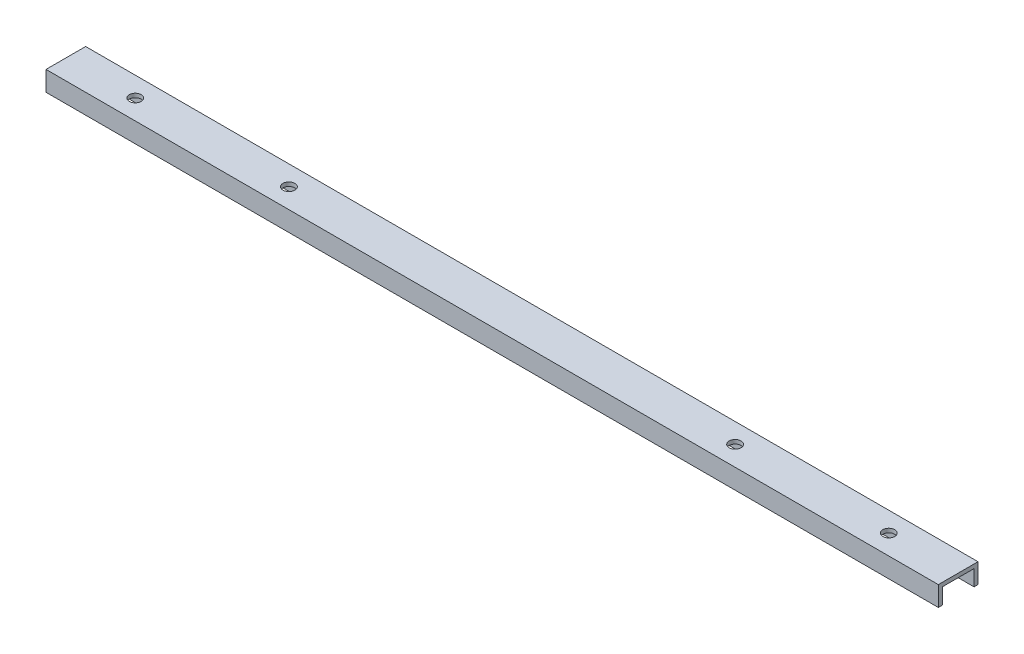
ISO-10303-21;
HEADER;
FILE_DESCRIPTION(('STEP AP214'),'2;1');
FILE_NAME('part.step','',(''),(''),'','','');
FILE_SCHEMA(('AUTOMOTIVE_DESIGN { 1 0 10303 214 1 1 1 1 }'));
ENDSEC;
DATA;
#1=APPLICATION_CONTEXT('core data for automotive mechanical design processes');
#2=APPLICATION_PROTOCOL_DEFINITION('international standard','automotive_design',2000,#1);
#3=PRODUCT_CONTEXT('',#1,'mechanical');
#4=PRODUCT('Part','Part','',(#3));
#5=PRODUCT_RELATED_PRODUCT_CATEGORY('part','',(#4));
#6=PRODUCT_DEFINITION_FORMATION('','',#4);
#7=PRODUCT_DEFINITION_CONTEXT('part definition',#1,'design');
#8=PRODUCT_DEFINITION('design','',#6,#7);
#9=PRODUCT_DEFINITION_SHAPE('','',#8);
#10=(LENGTH_UNIT() NAMED_UNIT(*) SI_UNIT(.MILLI.,.METRE.));
#11=(NAMED_UNIT(*) PLANE_ANGLE_UNIT() SI_UNIT($,.RADIAN.));
#12=(NAMED_UNIT(*) SI_UNIT($,.STERADIAN.) SOLID_ANGLE_UNIT());
#13=UNCERTAINTY_MEASURE_WITH_UNIT(LENGTH_MEASURE(1.E-05),#10,'distance_accuracy_value','');
#14=(GEOMETRIC_REPRESENTATION_CONTEXT(3) GLOBAL_UNCERTAINTY_ASSIGNED_CONTEXT((#13)) GLOBAL_UNIT_ASSIGNED_CONTEXT((#10,
#11,#12)) REPRESENTATION_CONTEXT('',''));
#15=CARTESIAN_POINT('',(0.,0.,0.));
#16=DIRECTION('',(0.,0.,1.));
#17=DIRECTION('',(1.,0.,0.));
#18=AXIS2_PLACEMENT_3D('',#15,#16,#17);
#19=CARTESIAN_POINT('',(450.,0.,18.));
#20=DIRECTION('',(0.,1.,0.));
#21=DIRECTION('',(0.,0.,1.));
#22=AXIS2_PLACEMENT_3D('',#19,#20,#21);
#23=PLANE('',#22);
#24=DIRECTION('',(0.,0.,-1.));
#25=VECTOR('',#24,1.);
#26=CARTESIAN_POINT('',(0.,0.,18.));
#27=LINE('',#26,#25);
#28=CARTESIAN_POINT('',(0.,0.,20.));
#29=VERTEX_POINT('',#28);
#30=CARTESIAN_POINT('',(0.,0.,18.));
#31=VERTEX_POINT('',#30);
#32=EDGE_CURVE('E139',#29,#31,#27,.T.);
#33=ORIENTED_EDGE('',*,*,#32,.T.);
#34=DIRECTION('',(-1.,0.,0.));
#35=VECTOR('',#34,1.);
#36=CARTESIAN_POINT('',(450.,0.,18.));
#37=LINE('',#36,#35);
#38=CARTESIAN_POINT('',(450.,0.,18.));
#39=VERTEX_POINT('',#38);
#40=EDGE_CURVE('E11',#39,#31,#37,.T.);
#41=ORIENTED_EDGE('',*,*,#40,.F.);
#42=DIRECTION('',(0.,0.,-1.));
#43=VECTOR('',#42,1.);
#44=CARTESIAN_POINT('',(450.,0.,18.));
#45=LINE('',#44,#43);
#46=CARTESIAN_POINT('',(450.,0.,20.));
#47=VERTEX_POINT('',#46);
#48=EDGE_CURVE('E162',#47,#39,#45,.T.);
#49=ORIENTED_EDGE('',*,*,#48,.F.);
#50=DIRECTION('',(-1.,0.,0.));
#51=VECTOR('',#50,1.);
#52=CARTESIAN_POINT('',(450.,0.,20.));
#53=LINE('',#52,#51);
#54=EDGE_CURVE('E135',#47,#29,#53,.T.);
#55=ORIENTED_EDGE('',*,*,#54,.T.);
#56=EDGE_LOOP('',(#33,#41,#49,#55));
#57=FACE_BOUND('',#56,.T.);
#58=ADVANCED_FACE('F38',(#57),#23,.F.);
#59=CARTESIAN_POINT('',(450.,8.,18.));
#60=DIRECTION('',(0.,0.,1.));
#61=DIRECTION('',(1.,0.,0.));
#62=AXIS2_PLACEMENT_3D('',#59,#60,#61);
#63=PLANE('',#62);
#64=DIRECTION('',(0.,1.,0.));
#65=VECTOR('',#64,1.);
#66=CARTESIAN_POINT('',(0.,8.,18.));
#67=LINE('',#66,#65);
#68=CARTESIAN_POINT('',(0.,8.,18.));
#69=VERTEX_POINT('',#68);
#70=EDGE_CURVE('E143',#31,#69,#67,.T.);
#71=ORIENTED_EDGE('',*,*,#70,.T.);
#72=DIRECTION('',(-1.,0.,0.));
#73=VECTOR('',#72,1.);
#74=CARTESIAN_POINT('',(450.,8.,18.));
#75=LINE('',#74,#73);
#76=CARTESIAN_POINT('',(450.,8.,18.));
#77=VERTEX_POINT('',#76);
#78=EDGE_CURVE('E47',#77,#69,#75,.T.);
#79=ORIENTED_EDGE('',*,*,#78,.F.);
#80=DIRECTION('',(0.,1.,0.));
#81=VECTOR('',#80,1.);
#82=CARTESIAN_POINT('',(450.,8.,18.));
#83=LINE('',#82,#81);
#84=EDGE_CURVE('E98',#39,#77,#83,.T.);
#85=ORIENTED_EDGE('',*,*,#84,.F.);
#86=ORIENTED_EDGE('',*,*,#40,.T.);
#87=EDGE_LOOP('',(#71,#79,#85,#86));
#88=FACE_BOUND('',#87,.T.);
#89=ADVANCED_FACE('F265',(#88),#63,.F.);
#90=CARTESIAN_POINT('',(450.,8.,2.));
#91=DIRECTION('',(0.,1.,0.));
#92=DIRECTION('',(0.,0.,1.));
#93=AXIS2_PLACEMENT_3D('',#90,#91,#92);
#94=PLANE('',#93);
#95=CARTESIAN_POINT('',(415.,8.,10.));
#96=DIRECTION('',(0.,1.,0.));
#97=DIRECTION('',(0.,0.,1.));
#98=AXIS2_PLACEMENT_3D('',#95,#96,#97);
#99=CIRCLE('',#98,2.99999999999999);
#100=CARTESIAN_POINT('',(415.,8.,13.));
#101=VERTEX_POINT('',#100);
#102=EDGE_CURVE('E144',#101,#101,#99,.F.);
#103=ORIENTED_EDGE('',*,*,#102,.F.);
#104=EDGE_LOOP('',(#103));
#105=FACE_BOUND('',#104,.T.);
#106=CARTESIAN_POINT('',(112.5,8.,10.));
#107=DIRECTION('',(0.,1.,0.));
#108=DIRECTION('',(0.,0.,1.));
#109=AXIS2_PLACEMENT_3D('',#106,#107,#108);
#110=CIRCLE('',#109,3.00000000000001);
#111=CARTESIAN_POINT('',(112.5,8.,13.));
#112=VERTEX_POINT('',#111);
#113=EDGE_CURVE('E215',#112,#112,#110,.F.);
#114=ORIENTED_EDGE('',*,*,#113,.F.);
#115=EDGE_LOOP('',(#114));
#116=FACE_BOUND('',#115,.T.);
#117=CARTESIAN_POINT('',(35.,8.,10.));
#118=DIRECTION('',(0.,1.,0.));
#119=DIRECTION('',(0.,0.,1.));
#120=AXIS2_PLACEMENT_3D('',#117,#118,#119);
#121=CIRCLE('',#120,3.);
#122=CARTESIAN_POINT('',(35.,8.,13.));
#123=VERTEX_POINT('',#122);
#124=EDGE_CURVE('E206',#123,#123,#121,.F.);
#125=ORIENTED_EDGE('',*,*,#124,.F.);
#126=EDGE_LOOP('',(#125));
#127=FACE_BOUND('',#126,.T.);
#128=CARTESIAN_POINT('',(337.5,8.,10.));
#129=DIRECTION('',(0.,1.,0.));
#130=DIRECTION('',(0.,0.,1.));
#131=AXIS2_PLACEMENT_3D('',#128,#129,#130);
#132=CIRCLE('',#131,2.99999999999999);
#133=CARTESIAN_POINT('',(337.5,8.,13.));
#134=VERTEX_POINT('',#133);
#135=EDGE_CURVE('E216',#134,#134,#132,.F.);
#136=ORIENTED_EDGE('',*,*,#135,.F.);
#137=EDGE_LOOP('',(#136));
#138=FACE_BOUND('',#137,.T.);
#139=DIRECTION('',(0.,0.,-1.));
#140=VECTOR('',#139,1.);
#141=CARTESIAN_POINT('',(0.,8.,2.));
#142=LINE('',#141,#140);
#143=CARTESIAN_POINT('',(0.,8.,2.));
#144=VERTEX_POINT('',#143);
#145=EDGE_CURVE('E147',#69,#144,#142,.T.);
#146=ORIENTED_EDGE('',*,*,#145,.T.);
#147=DIRECTION('',(-1.,0.,0.));
#148=VECTOR('',#147,1.);
#149=CARTESIAN_POINT('',(450.,8.,2.));
#150=LINE('',#149,#148);
#151=CARTESIAN_POINT('',(450.,8.,2.));
#152=VERTEX_POINT('',#151);
#153=EDGE_CURVE('E173',#152,#144,#150,.T.);
#154=ORIENTED_EDGE('',*,*,#153,.F.);
#155=DIRECTION('',(0.,0.,-1.));
#156=VECTOR('',#155,1.);
#157=CARTESIAN_POINT('',(450.,8.,2.));
#158=LINE('',#157,#156);
#159=EDGE_CURVE('E183',#77,#152,#158,.T.);
#160=ORIENTED_EDGE('',*,*,#159,.F.);
#161=ORIENTED_EDGE('',*,*,#78,.T.);
#162=EDGE_LOOP('',(#146,#154,#160,#161));
#163=FACE_BOUND('',#162,.T.);
#164=ADVANCED_FACE('F181',(#105,#116,#127,#138,#163),#94,.F.);
#165=CARTESIAN_POINT('',(450.,0.,2.));
#166=DIRECTION('',(0.,0.,-1.));
#167=DIRECTION('',(-1.,0.,0.));
#168=AXIS2_PLACEMENT_3D('',#165,#166,#167);
#169=PLANE('',#168);
#170=DIRECTION('',(0.,-1.,0.));
#171=VECTOR('',#170,1.);
#172=CARTESIAN_POINT('',(0.,0.,2.));
#173=LINE('',#172,#171);
#174=CARTESIAN_POINT('',(0.,0.,2.));
#175=VERTEX_POINT('',#174);
#176=EDGE_CURVE('E150',#144,#175,#173,.T.);
#177=ORIENTED_EDGE('',*,*,#176,.T.);
#178=DIRECTION('',(-1.,0.,0.));
#179=VECTOR('',#178,1.);
#180=CARTESIAN_POINT('',(450.,0.,2.));
#181=LINE('',#180,#179);
#182=CARTESIAN_POINT('',(450.,0.,2.));
#183=VERTEX_POINT('',#182);
#184=EDGE_CURVE('E169',#183,#175,#181,.T.);
#185=ORIENTED_EDGE('',*,*,#184,.F.);
#186=DIRECTION('',(0.,-1.,0.));
#187=VECTOR('',#186,1.);
#188=CARTESIAN_POINT('',(450.,0.,2.));
#189=LINE('',#188,#187);
#190=EDGE_CURVE('E196',#152,#183,#189,.T.);
#191=ORIENTED_EDGE('',*,*,#190,.F.);
#192=ORIENTED_EDGE('',*,*,#153,.T.);
#193=EDGE_LOOP('',(#177,#185,#191,#192));
#194=FACE_BOUND('',#193,.T.);
#195=ADVANCED_FACE('F191',(#194),#169,.F.);
#196=CARTESIAN_POINT('',(450.,0.,0.));
#197=DIRECTION('',(0.,1.,0.));
#198=DIRECTION('',(0.,0.,1.));
#199=AXIS2_PLACEMENT_3D('',#196,#197,#198);
#200=PLANE('',#199);
#201=DIRECTION('',(0.,0.,-1.));
#202=VECTOR('',#201,1.);
#203=CARTESIAN_POINT('',(0.,0.,0.));
#204=LINE('',#203,#202);
#205=CARTESIAN_POINT('',(0.,0.,0.));
#206=VERTEX_POINT('',#205);
#207=EDGE_CURVE('E153',#175,#206,#204,.T.);
#208=ORIENTED_EDGE('',*,*,#207,.T.);
#209=DIRECTION('',(-1.,0.,0.));
#210=VECTOR('',#209,1.);
#211=CARTESIAN_POINT('',(450.,0.,0.));
#212=LINE('',#211,#210);
#213=CARTESIAN_POINT('',(450.,0.,0.));
#214=VERTEX_POINT('',#213);
#215=EDGE_CURVE('E128',#214,#206,#212,.T.);
#216=ORIENTED_EDGE('',*,*,#215,.F.);
#217=DIRECTION('',(0.,0.,-1.));
#218=VECTOR('',#217,1.);
#219=CARTESIAN_POINT('',(450.,0.,0.));
#220=LINE('',#219,#218);
#221=EDGE_CURVE('E117',#183,#214,#220,.T.);
#222=ORIENTED_EDGE('',*,*,#221,.F.);
#223=ORIENTED_EDGE('',*,*,#184,.T.);
#224=EDGE_LOOP('',(#208,#216,#222,#223));
#225=FACE_BOUND('',#224,.T.);
#226=ADVANCED_FACE('F194',(#225),#200,.F.);
#227=CARTESIAN_POINT('',(450.,10.,0.));
#228=DIRECTION('',(0.,0.,1.));
#229=DIRECTION('',(1.,0.,0.));
#230=AXIS2_PLACEMENT_3D('',#227,#228,#229);
#231=PLANE('',#230);
#232=DIRECTION('',(0.,1.,0.));
#233=VECTOR('',#232,1.);
#234=CARTESIAN_POINT('',(0.,10.,0.));
#235=LINE('',#234,#233);
#236=CARTESIAN_POINT('',(0.,10.,0.));
#237=VERTEX_POINT('',#236);
#238=EDGE_CURVE('E126',#206,#237,#235,.T.);
#239=ORIENTED_EDGE('',*,*,#238,.T.);
#240=DIRECTION('',(-1.,0.,0.));
#241=VECTOR('',#240,1.);
#242=CARTESIAN_POINT('',(450.,10.,0.));
#243=LINE('',#242,#241);
#244=CARTESIAN_POINT('',(450.,10.,0.));
#245=VERTEX_POINT('',#244);
#246=EDGE_CURVE('E123',#245,#237,#243,.T.);
#247=ORIENTED_EDGE('',*,*,#246,.F.);
#248=DIRECTION('',(0.,1.,0.));
#249=VECTOR('',#248,1.);
#250=CARTESIAN_POINT('',(450.,10.,0.));
#251=LINE('',#250,#249);
#252=EDGE_CURVE('E111',#214,#245,#251,.T.);
#253=ORIENTED_EDGE('',*,*,#252,.F.);
#254=ORIENTED_EDGE('',*,*,#215,.T.);
#255=EDGE_LOOP('',(#239,#247,#253,#254));
#256=FACE_BOUND('',#255,.T.);
#257=ADVANCED_FACE('F124',(#256),#231,.F.);
#258=CARTESIAN_POINT('',(450.,10.,20.));
#259=DIRECTION('',(0.,-1.,0.));
#260=DIRECTION('',(0.,0.,-1.));
#261=AXIS2_PLACEMENT_3D('',#258,#259,#260);
#262=PLANE('',#261);
#263=CARTESIAN_POINT('',(415.,10.,10.));
#264=DIRECTION('',(0.,1.,0.));
#265=DIRECTION('',(0.,0.,1.));
#266=AXIS2_PLACEMENT_3D('',#263,#264,#265);
#267=CIRCLE('',#266,2.99999999999999);
#268=CARTESIAN_POINT('',(415.,10.,13.));
#269=VERTEX_POINT('',#268);
#270=EDGE_CURVE('E220',#269,#269,#267,.T.);
#271=ORIENTED_EDGE('',*,*,#270,.F.);
#272=EDGE_LOOP('',(#271));
#273=FACE_BOUND('',#272,.T.);
#274=CARTESIAN_POINT('',(112.5,10.,10.));
#275=DIRECTION('',(0.,1.,0.));
#276=DIRECTION('',(0.,0.,1.));
#277=AXIS2_PLACEMENT_3D('',#274,#275,#276);
#278=CIRCLE('',#277,3.00000000000001);
#279=CARTESIAN_POINT('',(112.5,10.,13.));
#280=VERTEX_POINT('',#279);
#281=EDGE_CURVE('E227',#280,#280,#278,.T.);
#282=ORIENTED_EDGE('',*,*,#281,.F.);
#283=EDGE_LOOP('',(#282));
#284=FACE_BOUND('',#283,.T.);
#285=CARTESIAN_POINT('',(35.,10.,10.));
#286=DIRECTION('',(0.,1.,0.));
#287=DIRECTION('',(0.,0.,1.));
#288=AXIS2_PLACEMENT_3D('',#285,#286,#287);
#289=CIRCLE('',#288,3.);
#290=CARTESIAN_POINT('',(35.,10.,13.));
#291=VERTEX_POINT('',#290);
#292=EDGE_CURVE('E211',#291,#291,#289,.T.);
#293=ORIENTED_EDGE('',*,*,#292,.F.);
#294=EDGE_LOOP('',(#293));
#295=FACE_BOUND('',#294,.T.);
#296=CARTESIAN_POINT('',(337.5,10.,10.));
#297=DIRECTION('',(0.,1.,0.));
#298=DIRECTION('',(0.,0.,1.));
#299=AXIS2_PLACEMENT_3D('',#296,#297,#298);
#300=CIRCLE('',#299,2.99999999999999);
#301=CARTESIAN_POINT('',(337.5,10.,13.));
#302=VERTEX_POINT('',#301);
#303=EDGE_CURVE('E210',#302,#302,#300,.T.);
#304=ORIENTED_EDGE('',*,*,#303,.F.);
#305=EDGE_LOOP('',(#304));
#306=FACE_BOUND('',#305,.T.);
#307=DIRECTION('',(0.,0.,1.));
#308=VECTOR('',#307,1.);
#309=CARTESIAN_POINT('',(0.,10.,20.));
#310=LINE('',#309,#308);
#311=CARTESIAN_POINT('',(0.,10.,20.));
#312=VERTEX_POINT('',#311);
#313=EDGE_CURVE('E84',#237,#312,#310,.T.);
#314=ORIENTED_EDGE('',*,*,#313,.T.);
#315=DIRECTION('',(-1.,0.,0.));
#316=VECTOR('',#315,1.);
#317=CARTESIAN_POINT('',(450.,10.,20.));
#318=LINE('',#317,#316);
#319=CARTESIAN_POINT('',(450.,10.,20.));
#320=VERTEX_POINT('',#319);
#321=EDGE_CURVE('E129',#320,#312,#318,.T.);
#322=ORIENTED_EDGE('',*,*,#321,.F.);
#323=DIRECTION('',(0.,0.,1.));
#324=VECTOR('',#323,1.);
#325=CARTESIAN_POINT('',(450.,10.,20.));
#326=LINE('',#325,#324);
#327=EDGE_CURVE('E115',#245,#320,#326,.T.);
#328=ORIENTED_EDGE('',*,*,#327,.F.);
#329=ORIENTED_EDGE('',*,*,#246,.T.);
#330=EDGE_LOOP('',(#314,#322,#328,#329));
#331=FACE_BOUND('',#330,.T.);
#332=ADVANCED_FACE('F131',(#273,#284,#295,#306,#331),#262,.F.);
#333=CARTESIAN_POINT('',(450.,0.,20.));
#334=DIRECTION('',(0.,0.,-1.));
#335=DIRECTION('',(-1.,0.,0.));
#336=AXIS2_PLACEMENT_3D('',#333,#334,#335);
#337=PLANE('',#336);
#338=DIRECTION('',(0.,-1.,0.));
#339=VECTOR('',#338,1.);
#340=CARTESIAN_POINT('',(0.,0.,20.));
#341=LINE('',#340,#339);
#342=EDGE_CURVE('E90',#312,#29,#341,.T.);
#343=ORIENTED_EDGE('',*,*,#342,.T.);
#344=ORIENTED_EDGE('',*,*,#54,.F.);
#345=DIRECTION('',(0.,-1.,0.));
#346=VECTOR('',#345,1.);
#347=CARTESIAN_POINT('',(450.,0.,20.));
#348=LINE('',#347,#346);
#349=EDGE_CURVE('E55',#320,#47,#348,.T.);
#350=ORIENTED_EDGE('',*,*,#349,.F.);
#351=ORIENTED_EDGE('',*,*,#321,.T.);
#352=EDGE_LOOP('',(#343,#344,#350,#351));
#353=FACE_BOUND('',#352,.T.);
#354=ADVANCED_FACE('F242',(#353),#337,.F.);
#355=CARTESIAN_POINT('',(450.,0.,0.));
#356=DIRECTION('',(-1.,0.,0.));
#357=DIRECTION('',(0.,0.,1.));
#358=AXIS2_PLACEMENT_3D('',#355,#356,#357);
#359=PLANE('',#358);
#360=ORIENTED_EDGE('',*,*,#48,.T.);
#361=ORIENTED_EDGE('',*,*,#84,.T.);
#362=ORIENTED_EDGE('',*,*,#159,.T.);
#363=ORIENTED_EDGE('',*,*,#190,.T.);
#364=ORIENTED_EDGE('',*,*,#221,.T.);
#365=ORIENTED_EDGE('',*,*,#252,.T.);
#366=ORIENTED_EDGE('',*,*,#327,.T.);
#367=ORIENTED_EDGE('',*,*,#349,.T.);
#368=EDGE_LOOP('',(#360,#361,#362,#363,#364,#365,#366,#367));
#369=FACE_BOUND('',#368,.T.);
#370=ADVANCED_FACE('F113',(#369),#359,.F.);
#371=CARTESIAN_POINT('',(0.,0.,0.));
#372=DIRECTION('',(-1.,0.,0.));
#373=DIRECTION('',(0.,0.,1.));
#374=AXIS2_PLACEMENT_3D('',#371,#372,#373);
#375=PLANE('',#374);
#376=ORIENTED_EDGE('',*,*,#32,.F.);
#377=ORIENTED_EDGE('',*,*,#342,.F.);
#378=ORIENTED_EDGE('',*,*,#313,.F.);
#379=ORIENTED_EDGE('',*,*,#238,.F.);
#380=ORIENTED_EDGE('',*,*,#207,.F.);
#381=ORIENTED_EDGE('',*,*,#176,.F.);
#382=ORIENTED_EDGE('',*,*,#145,.F.);
#383=ORIENTED_EDGE('',*,*,#70,.F.);
#384=EDGE_LOOP('',(#376,#377,#378,#379,#380,#381,#382,#383));
#385=FACE_BOUND('',#384,.T.);
#386=ADVANCED_FACE('F187',(#385),#375,.T.);
#387=CARTESIAN_POINT('',(337.5,-0.485281374238589,10.));
#388=DIRECTION('',(0.,1.,0.));
#389=DIRECTION('',(0.,0.,1.));
#390=AXIS2_PLACEMENT_3D('',#387,#388,#389);
#391=CYLINDRICAL_SURFACE('',#390,2.99999999999999);
#392=ORIENTED_EDGE('',*,*,#135,.T.);
#393=EDGE_LOOP('',(#392));
#394=FACE_BOUND('',#393,.T.);
#395=ORIENTED_EDGE('',*,*,#303,.T.);
#396=EDGE_LOOP('',(#395));
#397=FACE_BOUND('',#396,.T.);
#398=ADVANCED_FACE('F250',(#394,#397),#391,.F.);
#399=CARTESIAN_POINT('',(35.,-0.485281374238589,10.));
#400=DIRECTION('',(0.,1.,0.));
#401=DIRECTION('',(0.,0.,1.));
#402=AXIS2_PLACEMENT_3D('',#399,#400,#401);
#403=CYLINDRICAL_SURFACE('',#402,3.);
#404=ORIENTED_EDGE('',*,*,#124,.T.);
#405=EDGE_LOOP('',(#404));
#406=FACE_BOUND('',#405,.T.);
#407=ORIENTED_EDGE('',*,*,#292,.T.);
#408=EDGE_LOOP('',(#407));
#409=FACE_BOUND('',#408,.T.);
#410=ADVANCED_FACE('F252',(#406,#409),#403,.F.);
#411=CARTESIAN_POINT('',(112.5,-0.485281374238589,10.));
#412=DIRECTION('',(0.,1.,0.));
#413=DIRECTION('',(0.,0.,1.));
#414=AXIS2_PLACEMENT_3D('',#411,#412,#413);
#415=CYLINDRICAL_SURFACE('',#414,3.00000000000001);
#416=ORIENTED_EDGE('',*,*,#113,.T.);
#417=EDGE_LOOP('',(#416));
#418=FACE_BOUND('',#417,.T.);
#419=ORIENTED_EDGE('',*,*,#281,.T.);
#420=EDGE_LOOP('',(#419));
#421=FACE_BOUND('',#420,.T.);
#422=ADVANCED_FACE('F259',(#418,#421),#415,.F.);
#423=CARTESIAN_POINT('',(415.,-0.485281374238589,10.));
#424=DIRECTION('',(0.,1.,0.));
#425=DIRECTION('',(0.,0.,1.));
#426=AXIS2_PLACEMENT_3D('',#423,#424,#425);
#427=CYLINDRICAL_SURFACE('',#426,2.99999999999999);
#428=ORIENTED_EDGE('',*,*,#102,.T.);
#429=EDGE_LOOP('',(#428));
#430=FACE_BOUND('',#429,.T.);
#431=ORIENTED_EDGE('',*,*,#270,.T.);
#432=EDGE_LOOP('',(#431));
#433=FACE_BOUND('',#432,.T.);
#434=ADVANCED_FACE('F238',(#430,#433),#427,.F.);
#435=CLOSED_SHELL('',(#58,#89,#164,#195,#226,#257,#332,#354,#370,#386,#398,#410,#422,#434));
#436=MANIFOLD_SOLID_BREP('B2',#435);
#437=ADVANCED_BREP_SHAPE_REPRESENTATION('',(#18,#436),#14);
#438=SHAPE_DEFINITION_REPRESENTATION(#9,#437);
ENDSEC;
END-ISO-10303-21;
